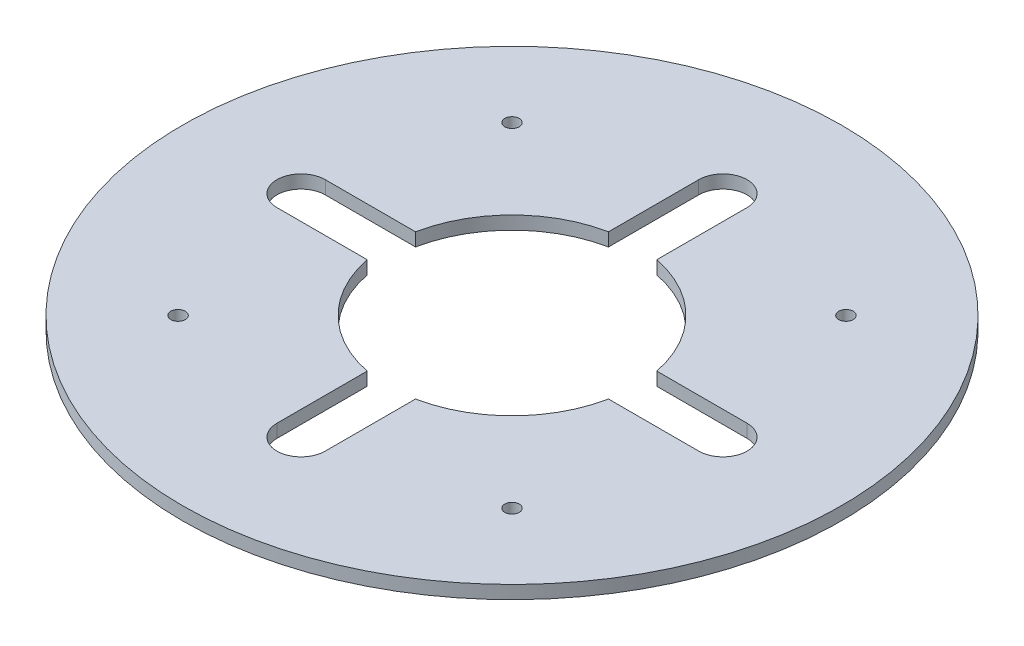
ISO-10303-21;
HEADER;
FILE_DESCRIPTION(('STEP AP214'),'2;1');
FILE_NAME('part.step','',(''),(''),'','','');
FILE_SCHEMA(('AUTOMOTIVE_DESIGN { 1 0 10303 214 1 1 1 1 }'));
ENDSEC;
DATA;
#1=APPLICATION_CONTEXT('core data for automotive mechanical design processes');
#2=APPLICATION_PROTOCOL_DEFINITION('international standard','automotive_design',2000,#1);
#3=PRODUCT_CONTEXT('',#1,'mechanical');
#4=PRODUCT('Part','Part','',(#3));
#5=PRODUCT_RELATED_PRODUCT_CATEGORY('part','',(#4));
#6=PRODUCT_DEFINITION_FORMATION('','',#4);
#7=PRODUCT_DEFINITION_CONTEXT('part definition',#1,'design');
#8=PRODUCT_DEFINITION('design','',#6,#7);
#9=PRODUCT_DEFINITION_SHAPE('','',#8);
#10=(LENGTH_UNIT() NAMED_UNIT(*) SI_UNIT(.MILLI.,.METRE.));
#11=(NAMED_UNIT(*) PLANE_ANGLE_UNIT() SI_UNIT($,.RADIAN.));
#12=(NAMED_UNIT(*) SI_UNIT($,.STERADIAN.) SOLID_ANGLE_UNIT());
#13=UNCERTAINTY_MEASURE_WITH_UNIT(LENGTH_MEASURE(1.E-05),#10,'distance_accuracy_value','');
#14=(GEOMETRIC_REPRESENTATION_CONTEXT(3) GLOBAL_UNCERTAINTY_ASSIGNED_CONTEXT((#13)) GLOBAL_UNIT_ASSIGNED_CONTEXT((#10,
#11,#12)) REPRESENTATION_CONTEXT('',''));
#15=CARTESIAN_POINT('',(0.,0.,0.));
#16=DIRECTION('',(0.,0.,1.));
#17=DIRECTION('',(1.,0.,0.));
#18=AXIS2_PLACEMENT_3D('',#15,#16,#17);
#19=CARTESIAN_POINT('',(0.,3.,0.));
#20=DIRECTION('',(0.,1.,0.));
#21=DIRECTION('',(0.,0.,1.));
#22=AXIS2_PLACEMENT_3D('',#19,#20,#21);
#23=PLANE('',#22);
#24=CARTESIAN_POINT('',(38.0000000000004,3.,37.9999999999996));
#25=DIRECTION('',(0.,1.,0.));
#26=DIRECTION('',(0.,0.,1.));
#27=AXIS2_PLACEMENT_3D('',#24,#25,#26);
#28=CIRCLE('',#27,1.65);
#29=CARTESIAN_POINT('',(38.0000000000004,3.,39.6499999999996));
#30=VERTEX_POINT('',#29);
#31=EDGE_CURVE('E445',#30,#30,#28,.T.);
#32=ORIENTED_EDGE('',*,*,#31,.F.);
#33=EDGE_LOOP('',(#32));
#34=FACE_BOUND('',#33,.T.);
#35=CARTESIAN_POINT('',(-38.,3.,38.));
#36=DIRECTION('',(0.,1.,0.));
#37=DIRECTION('',(0.,0.,1.));
#38=AXIS2_PLACEMENT_3D('',#35,#36,#37);
#39=CIRCLE('',#38,1.65);
#40=CARTESIAN_POINT('',(-38.,3.,39.65));
#41=VERTEX_POINT('',#40);
#42=EDGE_CURVE('E449',#41,#41,#39,.T.);
#43=ORIENTED_EDGE('',*,*,#42,.F.);
#44=EDGE_LOOP('',(#43));
#45=FACE_BOUND('',#44,.T.);
#46=CARTESIAN_POINT('',(-38.0000000000001,3.,-37.9999999999999));
#47=DIRECTION('',(0.,1.,0.));
#48=DIRECTION('',(0.,0.,1.));
#49=AXIS2_PLACEMENT_3D('',#46,#47,#48);
#50=CIRCLE('',#49,1.65);
#51=CARTESIAN_POINT('',(-38.0000000000001,3.,-36.3499999999999));
#52=VERTEX_POINT('',#51);
#53=EDGE_CURVE('E459',#52,#52,#50,.T.);
#54=ORIENTED_EDGE('',*,*,#53,.F.);
#55=EDGE_LOOP('',(#54));
#56=FACE_BOUND('',#55,.T.);
#57=CARTESIAN_POINT('',(38.,3.,-38.));
#58=DIRECTION('',(0.,1.,0.));
#59=DIRECTION('',(0.,0.,1.));
#60=AXIS2_PLACEMENT_3D('',#57,#58,#59);
#61=CIRCLE('',#60,1.65);
#62=CARTESIAN_POINT('',(38.,3.,-36.35));
#63=VERTEX_POINT('',#62);
#64=EDGE_CURVE('E466',#63,#63,#61,.T.);
#65=ORIENTED_EDGE('',*,*,#64,.F.);
#66=EDGE_LOOP('',(#65));
#67=FACE_BOUND('',#66,.T.);
#68=CARTESIAN_POINT('',(0.,3.,0.));
#69=DIRECTION('',(0.,1.,0.));
#70=DIRECTION('',(0.,0.,1.));
#71=AXIS2_PLACEMENT_3D('',#68,#69,#70);
#72=CIRCLE('',#71,75.);
#73=CARTESIAN_POINT('',(0.,3.,75.));
#74=VERTEX_POINT('',#73);
#75=EDGE_CURVE('E11',#74,#74,#72,.T.);
#76=ORIENTED_EDGE('',*,*,#75,.T.);
#77=EDGE_LOOP('',(#76));
#78=FACE_BOUND('',#77,.T.);
#79=CARTESIAN_POINT('',(-48.,3.,1.6759110426447E-13));
#80=DIRECTION('',(0.,1.,0.));
#81=DIRECTION('',(1.,0.,0.));
#82=AXIS2_PLACEMENT_3D('',#79,#80,#81);
#83=CIRCLE('',#82,5.5);
#84=CARTESIAN_POINT('',(-48.,3.,-5.49999999999983));
#85=VERTEX_POINT('',#84);
#86=CARTESIAN_POINT('',(-48.,3.,5.50000000000017));
#87=VERTEX_POINT('',#86);
#88=EDGE_CURVE('E250',#85,#87,#83,.T.);
#89=ORIENTED_EDGE('',*,*,#88,.F.);
#90=DIRECTION('',(1.,0.,0.));
#91=VECTOR('',#90,1.);
#92=CARTESIAN_POINT('',(0.,3.,-5.5));
#93=LINE('',#92,#91);
#94=CARTESIAN_POINT('',(-27.4545078265847,3.,-5.4999999999999));
#95=VERTEX_POINT('',#94);
#96=EDGE_CURVE('E225',#85,#95,#93,.T.);
#97=ORIENTED_EDGE('',*,*,#96,.T.);
#98=CARTESIAN_POINT('',(0.,3.,0.));
#99=DIRECTION('',(0.,1.,0.));
#100=DIRECTION('',(0.,0.,1.));
#101=AXIS2_PLACEMENT_3D('',#98,#99,#100);
#102=CIRCLE('',#101,28.);
#103=CARTESIAN_POINT('',(-5.5,3.,-27.4545078265847));
#104=VERTEX_POINT('',#103);
#105=EDGE_CURVE('E306',#104,#95,#102,.T.);
#106=ORIENTED_EDGE('',*,*,#105,.F.);
#107=DIRECTION('',(0.,0.,1.));
#108=VECTOR('',#107,1.);
#109=CARTESIAN_POINT('',(-5.5,3.,0.));
#110=LINE('',#109,#108);
#111=CARTESIAN_POINT('',(-5.5,3.,-48.));
#112=VERTEX_POINT('',#111);
#113=EDGE_CURVE('E274',#112,#104,#110,.T.);
#114=ORIENTED_EDGE('',*,*,#113,.F.);
#115=CARTESIAN_POINT('',(0.,3.,-48.));
#116=DIRECTION('',(0.,1.,0.));
#117=DIRECTION('',(0.,0.,1.));
#118=AXIS2_PLACEMENT_3D('',#115,#116,#117);
#119=CIRCLE('',#118,5.5);
#120=CARTESIAN_POINT('',(5.5,3.,-48.));
#121=VERTEX_POINT('',#120);
#122=EDGE_CURVE('E286',#121,#112,#119,.T.);
#123=ORIENTED_EDGE('',*,*,#122,.F.);
#124=DIRECTION('',(0.,0.,1.));
#125=VECTOR('',#124,1.);
#126=CARTESIAN_POINT('',(5.5,3.,0.));
#127=LINE('',#126,#125);
#128=CARTESIAN_POINT('',(5.5,3.,-27.4545078265847));
#129=VERTEX_POINT('',#128);
#130=EDGE_CURVE('E259',#121,#129,#127,.T.);
#131=ORIENTED_EDGE('',*,*,#130,.T.);
#132=CARTESIAN_POINT('',(27.4545078265846,3.,-5.50000000000029));
#133=VERTEX_POINT('',#132);
#134=EDGE_CURVE('E311',#133,#129,#102,.T.);
#135=ORIENTED_EDGE('',*,*,#134,.F.);
#136=DIRECTION('',(-1.,0.,0.));
#137=VECTOR('',#136,1.);
#138=CARTESIAN_POINT('',(0.,3.,-5.5));
#139=LINE('',#138,#137);
#140=CARTESIAN_POINT('',(47.9999999999999,3.,-5.5000000000005));
#141=VERTEX_POINT('',#140);
#142=EDGE_CURVE('E177',#141,#133,#139,.T.);
#143=ORIENTED_EDGE('',*,*,#142,.F.);
#144=CARTESIAN_POINT('',(48.,3.,-5.02773312793411E-13));
#145=DIRECTION('',(0.,1.,0.));
#146=DIRECTION('',(-1.,0.,0.));
#147=AXIS2_PLACEMENT_3D('',#144,#145,#146);
#148=CIRCLE('',#147,5.5);
#149=CARTESIAN_POINT('',(48.0000000000001,3.,5.4999999999995));
#150=VERTEX_POINT('',#149);
#151=EDGE_CURVE('E180',#150,#141,#148,.T.);
#152=ORIENTED_EDGE('',*,*,#151,.F.);
#153=DIRECTION('',(-1.,0.,0.));
#154=VECTOR('',#153,1.);
#155=CARTESIAN_POINT('',(0.,3.,5.5));
#156=LINE('',#155,#154);
#157=CARTESIAN_POINT('',(27.4545078265848,3.,5.49999999999971));
#158=VERTEX_POINT('',#157);
#159=EDGE_CURVE('E154',#150,#158,#156,.T.);
#160=ORIENTED_EDGE('',*,*,#159,.T.);
#161=CARTESIAN_POINT('',(5.5,3.,27.4545078265847));
#162=VERTEX_POINT('',#161);
#163=EDGE_CURVE('E319',#162,#158,#102,.T.);
#164=ORIENTED_EDGE('',*,*,#163,.F.);
#165=DIRECTION('',(0.,0.,-1.));
#166=VECTOR('',#165,1.);
#167=CARTESIAN_POINT('',(5.5,3.,0.));
#168=LINE('',#167,#166);
#169=CARTESIAN_POINT('',(5.5,3.,48.));
#170=VERTEX_POINT('',#169);
#171=EDGE_CURVE('E62',#170,#162,#168,.T.);
#172=ORIENTED_EDGE('',*,*,#171,.F.);
#173=CARTESIAN_POINT('',(0.,3.,48.));
#174=DIRECTION('',(0.,1.,0.));
#175=DIRECTION('',(0.,0.,-1.));
#176=AXIS2_PLACEMENT_3D('',#173,#174,#175);
#177=CIRCLE('',#176,5.5);
#178=CARTESIAN_POINT('',(-5.5,3.,48.));
#179=VERTEX_POINT('',#178);
#180=EDGE_CURVE('E216',#179,#170,#177,.T.);
#181=ORIENTED_EDGE('',*,*,#180,.F.);
#182=DIRECTION('',(0.,0.,-1.));
#183=VECTOR('',#182,1.);
#184=CARTESIAN_POINT('',(-5.5,3.,0.));
#185=LINE('',#184,#183);
#186=CARTESIAN_POINT('',(-5.5,3.,27.4545078265847));
#187=VERTEX_POINT('',#186);
#188=EDGE_CURVE('E195',#179,#187,#185,.T.);
#189=ORIENTED_EDGE('',*,*,#188,.T.);
#190=CARTESIAN_POINT('',(-27.4545078265847,3.,5.5000000000001));
#191=VERTEX_POINT('',#190);
#192=EDGE_CURVE('E310',#191,#187,#102,.T.);
#193=ORIENTED_EDGE('',*,*,#192,.F.);
#194=DIRECTION('',(1.,0.,0.));
#195=VECTOR('',#194,1.);
#196=CARTESIAN_POINT('',(0.,3.,5.5));
#197=LINE('',#196,#195);
#198=EDGE_CURVE('E238',#87,#191,#197,.T.);
#199=ORIENTED_EDGE('',*,*,#198,.F.);
#200=EDGE_LOOP('',(#89,#97,#106,#114,#123,#131,#135,#143,#152,#160,#164,#172,#181,#189,#193,#199));
#201=FACE_BOUND('',#200,.T.);
#202=ADVANCED_FACE('F38',(#34,#45,#56,#67,#78,#201),#23,.T.);
#203=CARTESIAN_POINT('',(0.,0.,0.));
#204=DIRECTION('',(0.,1.,0.));
#205=DIRECTION('',(0.,0.,1.));
#206=AXIS2_PLACEMENT_3D('',#203,#204,#205);
#207=PLANE('',#206);
#208=CARTESIAN_POINT('',(38.0000000000004,0.,37.9999999999996));
#209=DIRECTION('',(0.,1.,0.));
#210=DIRECTION('',(0.,0.,1.));
#211=AXIS2_PLACEMENT_3D('',#208,#209,#210);
#212=CIRCLE('',#211,1.65);
#213=CARTESIAN_POINT('',(38.0000000000004,0.,39.6499999999996));
#214=VERTEX_POINT('',#213);
#215=EDGE_CURVE('E442',#214,#214,#212,.T.);
#216=ORIENTED_EDGE('',*,*,#215,.T.);
#217=EDGE_LOOP('',(#216));
#218=FACE_BOUND('',#217,.T.);
#219=CARTESIAN_POINT('',(-38.,0.,38.));
#220=DIRECTION('',(0.,1.,0.));
#221=DIRECTION('',(0.,0.,1.));
#222=AXIS2_PLACEMENT_3D('',#219,#220,#221);
#223=CIRCLE('',#222,1.65);
#224=CARTESIAN_POINT('',(-38.,0.,39.65));
#225=VERTEX_POINT('',#224);
#226=EDGE_CURVE('E455',#225,#225,#223,.T.);
#227=ORIENTED_EDGE('',*,*,#226,.T.);
#228=EDGE_LOOP('',(#227));
#229=FACE_BOUND('',#228,.T.);
#230=CARTESIAN_POINT('',(-38.0000000000001,0.,-37.9999999999999));
#231=DIRECTION('',(0.,1.,0.));
#232=DIRECTION('',(0.,0.,1.));
#233=AXIS2_PLACEMENT_3D('',#230,#231,#232);
#234=CIRCLE('',#233,1.65);
#235=CARTESIAN_POINT('',(-38.0000000000001,0.,-36.3499999999999));
#236=VERTEX_POINT('',#235);
#237=EDGE_CURVE('E463',#236,#236,#234,.T.);
#238=ORIENTED_EDGE('',*,*,#237,.T.);
#239=EDGE_LOOP('',(#238));
#240=FACE_BOUND('',#239,.T.);
#241=CARTESIAN_POINT('',(38.,0.,-38.));
#242=DIRECTION('',(0.,1.,0.));
#243=DIRECTION('',(0.,0.,1.));
#244=AXIS2_PLACEMENT_3D('',#241,#242,#243);
#245=CIRCLE('',#244,1.65);
#246=CARTESIAN_POINT('',(38.,0.,-36.35));
#247=VERTEX_POINT('',#246);
#248=EDGE_CURVE('E183',#247,#247,#245,.T.);
#249=ORIENTED_EDGE('',*,*,#248,.T.);
#250=EDGE_LOOP('',(#249));
#251=FACE_BOUND('',#250,.T.);
#252=CARTESIAN_POINT('',(0.,0.,0.));
#253=DIRECTION('',(0.,1.,0.));
#254=DIRECTION('',(0.,0.,1.));
#255=AXIS2_PLACEMENT_3D('',#252,#253,#254);
#256=CIRCLE('',#255,75.);
#257=CARTESIAN_POINT('',(0.,0.,75.));
#258=VERTEX_POINT('',#257);
#259=EDGE_CURVE('E42',#258,#258,#256,.T.);
#260=ORIENTED_EDGE('',*,*,#259,.F.);
#261=EDGE_LOOP('',(#260));
#262=FACE_BOUND('',#261,.T.);
#263=DIRECTION('',(1.,0.,0.));
#264=VECTOR('',#263,1.);
#265=CARTESIAN_POINT('',(0.,0.,-5.5));
#266=LINE('',#265,#264);
#267=CARTESIAN_POINT('',(-48.,0.,-5.49999999999983));
#268=VERTEX_POINT('',#267);
#269=CARTESIAN_POINT('',(-27.4545078265847,0.,-5.4999999999999));
#270=VERTEX_POINT('',#269);
#271=EDGE_CURVE('E234',#268,#270,#266,.T.);
#272=ORIENTED_EDGE('',*,*,#271,.F.);
#273=CARTESIAN_POINT('',(-48.,0.,1.6759110426447E-13));
#274=DIRECTION('',(0.,1.,0.));
#275=DIRECTION('',(1.,0.,0.));
#276=AXIS2_PLACEMENT_3D('',#273,#274,#275);
#277=CIRCLE('',#276,5.5);
#278=CARTESIAN_POINT('',(-48.,0.,5.50000000000017));
#279=VERTEX_POINT('',#278);
#280=EDGE_CURVE('E237',#268,#279,#277,.T.);
#281=ORIENTED_EDGE('',*,*,#280,.T.);
#282=DIRECTION('',(1.,0.,0.));
#283=VECTOR('',#282,1.);
#284=CARTESIAN_POINT('',(0.,0.,5.5));
#285=LINE('',#284,#283);
#286=CARTESIAN_POINT('',(-27.4545078265847,0.,5.50000000000009));
#287=VERTEX_POINT('',#286);
#288=EDGE_CURVE('E242',#279,#287,#285,.T.);
#289=ORIENTED_EDGE('',*,*,#288,.T.);
#290=CARTESIAN_POINT('',(0.,0.,0.));
#291=DIRECTION('',(0.,1.,0.));
#292=DIRECTION('',(0.,0.,1.));
#293=AXIS2_PLACEMENT_3D('',#290,#291,#292);
#294=CIRCLE('',#293,28.);
#295=CARTESIAN_POINT('',(-5.5,0.,27.4545078265847));
#296=VERTEX_POINT('',#295);
#297=EDGE_CURVE('E315',#287,#296,#294,.T.);
#298=ORIENTED_EDGE('',*,*,#297,.T.);
#299=DIRECTION('',(0.,0.,-1.));
#300=VECTOR('',#299,1.);
#301=CARTESIAN_POINT('',(-5.5,0.,0.));
#302=LINE('',#301,#300);
#303=CARTESIAN_POINT('',(-5.5,0.,48.));
#304=VERTEX_POINT('',#303);
#305=EDGE_CURVE('E202',#304,#296,#302,.T.);
#306=ORIENTED_EDGE('',*,*,#305,.F.);
#307=CARTESIAN_POINT('',(0.,0.,48.));
#308=DIRECTION('',(0.,1.,0.));
#309=DIRECTION('',(0.,0.,-1.));
#310=AXIS2_PLACEMENT_3D('',#307,#308,#309);
#311=CIRCLE('',#310,5.5);
#312=CARTESIAN_POINT('',(5.5,0.,48.));
#313=VERTEX_POINT('',#312);
#314=EDGE_CURVE('E205',#304,#313,#311,.T.);
#315=ORIENTED_EDGE('',*,*,#314,.T.);
#316=DIRECTION('',(0.,0.,-1.));
#317=VECTOR('',#316,1.);
#318=CARTESIAN_POINT('',(5.5,0.,0.));
#319=LINE('',#318,#317);
#320=CARTESIAN_POINT('',(5.5,0.,27.4545078265847));
#321=VERTEX_POINT('',#320);
#322=EDGE_CURVE('E209',#313,#321,#319,.T.);
#323=ORIENTED_EDGE('',*,*,#322,.T.);
#324=CARTESIAN_POINT('',(27.4545078265847,0.,5.49999999999971));
#325=VERTEX_POINT('',#324);
#326=EDGE_CURVE('E175',#321,#325,#294,.T.);
#327=ORIENTED_EDGE('',*,*,#326,.T.);
#328=DIRECTION('',(-1.,0.,0.));
#329=VECTOR('',#328,1.);
#330=CARTESIAN_POINT('',(0.,0.,5.5));
#331=LINE('',#330,#329);
#332=CARTESIAN_POINT('',(48.0000000000001,0.,5.4999999999995));
#333=VERTEX_POINT('',#332);
#334=EDGE_CURVE('E54',#333,#325,#331,.T.);
#335=ORIENTED_EDGE('',*,*,#334,.F.);
#336=CARTESIAN_POINT('',(48.,0.,-5.02773312793411E-13));
#337=DIRECTION('',(0.,1.,0.));
#338=DIRECTION('',(-1.,0.,0.));
#339=AXIS2_PLACEMENT_3D('',#336,#337,#338);
#340=CIRCLE('',#339,5.5);
#341=CARTESIAN_POINT('',(47.9999999999999,0.,-5.5000000000005));
#342=VERTEX_POINT('',#341);
#343=EDGE_CURVE('E163',#333,#342,#340,.T.);
#344=ORIENTED_EDGE('',*,*,#343,.T.);
#345=DIRECTION('',(-1.,0.,0.));
#346=VECTOR('',#345,1.);
#347=CARTESIAN_POINT('',(0.,0.,-5.5));
#348=LINE('',#347,#346);
#349=CARTESIAN_POINT('',(27.4545078265846,0.,-5.50000000000029));
#350=VERTEX_POINT('',#349);
#351=EDGE_CURVE('E160',#342,#350,#348,.T.);
#352=ORIENTED_EDGE('',*,*,#351,.T.);
#353=CARTESIAN_POINT('',(5.5,0.,-27.4545078265847));
#354=VERTEX_POINT('',#353);
#355=EDGE_CURVE('E296',#350,#354,#294,.T.);
#356=ORIENTED_EDGE('',*,*,#355,.T.);
#357=DIRECTION('',(0.,0.,1.));
#358=VECTOR('',#357,1.);
#359=CARTESIAN_POINT('',(5.5,0.,0.));
#360=LINE('',#359,#358);
#361=CARTESIAN_POINT('',(5.5,0.,-48.));
#362=VERTEX_POINT('',#361);
#363=EDGE_CURVE('E269',#362,#354,#360,.T.);
#364=ORIENTED_EDGE('',*,*,#363,.F.);
#365=CARTESIAN_POINT('',(0.,0.,-48.));
#366=DIRECTION('',(0.,1.,0.));
#367=DIRECTION('',(0.,0.,1.));
#368=AXIS2_PLACEMENT_3D('',#365,#366,#367);
#369=CIRCLE('',#368,5.5);
#370=CARTESIAN_POINT('',(-5.5,0.,-48.));
#371=VERTEX_POINT('',#370);
#372=EDGE_CURVE('E273',#362,#371,#369,.T.);
#373=ORIENTED_EDGE('',*,*,#372,.T.);
#374=DIRECTION('',(0.,0.,1.));
#375=VECTOR('',#374,1.);
#376=CARTESIAN_POINT('',(-5.5,0.,0.));
#377=LINE('',#376,#375);
#378=CARTESIAN_POINT('',(-5.5,0.,-27.4545078265847));
#379=VERTEX_POINT('',#378);
#380=EDGE_CURVE('E278',#371,#379,#377,.T.);
#381=ORIENTED_EDGE('',*,*,#380,.T.);
#382=EDGE_CURVE('E312',#379,#270,#294,.T.);
#383=ORIENTED_EDGE('',*,*,#382,.T.);
#384=EDGE_LOOP('',(#272,#281,#289,#298,#306,#315,#323,#327,#335,#344,#352,#356,#364,#373,#381,#383));
#385=FACE_BOUND('',#384,.T.);
#386=ADVANCED_FACE('F172',(#218,#229,#240,#251,#262,#385),#207,.F.);
#387=CARTESIAN_POINT('',(0.,3.,0.));
#388=DIRECTION('',(0.,-1.,0.));
#389=DIRECTION('',(0.,0.,-1.));
#390=AXIS2_PLACEMENT_3D('',#387,#388,#389);
#391=CYLINDRICAL_SURFACE('',#390,28.);
#392=ORIENTED_EDGE('',*,*,#105,.T.);
#393=DIRECTION('',(0.,1.,0.));
#394=VECTOR('',#393,1.);
#395=CARTESIAN_POINT('',(-27.4545078265847,0.,-5.4999999999999));
#396=LINE('',#395,#394);
#397=EDGE_CURVE('E256',#270,#95,#396,.T.);
#398=ORIENTED_EDGE('',*,*,#397,.F.);
#399=ORIENTED_EDGE('',*,*,#382,.F.);
#400=DIRECTION('',(0.,1.,0.));
#401=VECTOR('',#400,1.);
#402=CARTESIAN_POINT('',(-5.5,0.,-27.4545078265847));
#403=LINE('',#402,#401);
#404=EDGE_CURVE('E297',#379,#104,#403,.T.);
#405=ORIENTED_EDGE('',*,*,#404,.T.);
#406=EDGE_LOOP('',(#392,#398,#399,#405));
#407=FACE_BOUND('',#406,.T.);
#408=ADVANCED_FACE('F345',(#407),#391,.F.);
#409=ORIENTED_EDGE('',*,*,#163,.T.);
#410=DIRECTION('',(0.,1.,0.));
#411=VECTOR('',#410,1.);
#412=CARTESIAN_POINT('',(27.4545078265848,0.,5.49999999999971));
#413=LINE('',#412,#411);
#414=EDGE_CURVE('E192',#325,#158,#413,.T.);
#415=ORIENTED_EDGE('',*,*,#414,.F.);
#416=ORIENTED_EDGE('',*,*,#326,.F.);
#417=DIRECTION('',(0.,1.,0.));
#418=VECTOR('',#417,1.);
#419=CARTESIAN_POINT('',(5.5,0.,27.4545078265847));
#420=LINE('',#419,#418);
#421=EDGE_CURVE('E226',#321,#162,#420,.T.);
#422=ORIENTED_EDGE('',*,*,#421,.T.);
#423=EDGE_LOOP('',(#409,#415,#416,#422));
#424=FACE_BOUND('',#423,.T.);
#425=ADVANCED_FACE('F373',(#424),#391,.F.);
#426=DIRECTION('',(0.,1.,0.));
#427=VECTOR('',#426,1.);
#428=CARTESIAN_POINT('',(-27.4545078265847,0.,5.50000000000009));
#429=LINE('',#428,#427);
#430=EDGE_CURVE('E260',#287,#191,#429,.T.);
#431=ORIENTED_EDGE('',*,*,#430,.T.);
#432=ORIENTED_EDGE('',*,*,#192,.T.);
#433=DIRECTION('',(0.,1.,0.));
#434=VECTOR('',#433,1.);
#435=CARTESIAN_POINT('',(-5.5,0.,27.4545078265847));
#436=LINE('',#435,#434);
#437=EDGE_CURVE('E222',#296,#187,#436,.T.);
#438=ORIENTED_EDGE('',*,*,#437,.F.);
#439=ORIENTED_EDGE('',*,*,#297,.F.);
#440=EDGE_LOOP('',(#431,#432,#438,#439));
#441=FACE_BOUND('',#440,.T.);
#442=ADVANCED_FACE('F360',(#441),#391,.F.);
#443=DIRECTION('',(0.,1.,0.));
#444=VECTOR('',#443,1.);
#445=CARTESIAN_POINT('',(27.4545078265846,0.,-5.50000000000029));
#446=LINE('',#445,#444);
#447=EDGE_CURVE('E196',#350,#133,#446,.T.);
#448=ORIENTED_EDGE('',*,*,#447,.T.);
#449=ORIENTED_EDGE('',*,*,#134,.T.);
#450=DIRECTION('',(0.,1.,0.));
#451=VECTOR('',#450,1.);
#452=CARTESIAN_POINT('',(5.5,0.,-27.4545078265847));
#453=LINE('',#452,#451);
#454=EDGE_CURVE('E292',#354,#129,#453,.T.);
#455=ORIENTED_EDGE('',*,*,#454,.F.);
#456=ORIENTED_EDGE('',*,*,#355,.F.);
#457=EDGE_LOOP('',(#448,#449,#455,#456));
#458=FACE_BOUND('',#457,.T.);
#459=ADVANCED_FACE('F331',(#458),#391,.F.);
#460=CARTESIAN_POINT('',(0.,3.,0.));
#461=DIRECTION('',(0.,-1.,0.));
#462=DIRECTION('',(0.,0.,-1.));
#463=AXIS2_PLACEMENT_3D('',#460,#461,#462);
#464=CYLINDRICAL_SURFACE('',#463,75.);
#465=ORIENTED_EDGE('',*,*,#75,.F.);
#466=EDGE_LOOP('',(#465));
#467=FACE_BOUND('',#466,.T.);
#468=ORIENTED_EDGE('',*,*,#259,.T.);
#469=EDGE_LOOP('',(#468));
#470=FACE_BOUND('',#469,.T.);
#471=ADVANCED_FACE('F40',(#467,#470),#464,.T.);
#472=CARTESIAN_POINT('',(5.5,0.,0.));
#473=DIRECTION('',(-1.,0.,0.));
#474=DIRECTION('',(0.,0.,1.));
#475=AXIS2_PLACEMENT_3D('',#472,#473,#474);
#476=PLANE('',#475);
#477=ORIENTED_EDGE('',*,*,#130,.F.);
#478=DIRECTION('',(0.,1.,0.));
#479=VECTOR('',#478,1.);
#480=CARTESIAN_POINT('',(5.5,0.,-48.));
#481=LINE('',#480,#479);
#482=EDGE_CURVE('E282',#362,#121,#481,.T.);
#483=ORIENTED_EDGE('',*,*,#482,.F.);
#484=ORIENTED_EDGE('',*,*,#363,.T.);
#485=ORIENTED_EDGE('',*,*,#454,.T.);
#486=EDGE_LOOP('',(#477,#483,#484,#485));
#487=FACE_BOUND('',#486,.T.);
#488=ADVANCED_FACE('F329',(#487),#476,.T.);
#489=CARTESIAN_POINT('',(-5.5,0.,0.));
#490=DIRECTION('',(-1.,0.,0.));
#491=DIRECTION('',(0.,0.,1.));
#492=AXIS2_PLACEMENT_3D('',#489,#490,#491);
#493=PLANE('',#492);
#494=ORIENTED_EDGE('',*,*,#113,.T.);
#495=ORIENTED_EDGE('',*,*,#404,.F.);
#496=ORIENTED_EDGE('',*,*,#380,.F.);
#497=DIRECTION('',(0.,1.,0.));
#498=VECTOR('',#497,1.);
#499=CARTESIAN_POINT('',(-5.5,0.,-48.));
#500=LINE('',#499,#498);
#501=EDGE_CURVE('E301',#371,#112,#500,.T.);
#502=ORIENTED_EDGE('',*,*,#501,.T.);
#503=EDGE_LOOP('',(#494,#495,#496,#502));
#504=FACE_BOUND('',#503,.T.);
#505=ADVANCED_FACE('F396',(#504),#493,.F.);
#506=CARTESIAN_POINT('',(0.,0.,-48.));
#507=DIRECTION('',(0.,1.,0.));
#508=DIRECTION('',(0.,0.,1.));
#509=AXIS2_PLACEMENT_3D('',#506,#507,#508);
#510=CYLINDRICAL_SURFACE('',#509,5.5);
#511=ORIENTED_EDGE('',*,*,#122,.T.);
#512=ORIENTED_EDGE('',*,*,#501,.F.);
#513=ORIENTED_EDGE('',*,*,#372,.F.);
#514=ORIENTED_EDGE('',*,*,#482,.T.);
#515=EDGE_LOOP('',(#511,#512,#513,#514));
#516=FACE_BOUND('',#515,.T.);
#517=ADVANCED_FACE('F340',(#516),#510,.F.);
#518=CARTESIAN_POINT('',(5.5,0.,0.));
#519=DIRECTION('',(1.,0.,0.));
#520=DIRECTION('',(0.,0.,-1.));
#521=AXIS2_PLACEMENT_3D('',#518,#519,#520);
#522=PLANE('',#521);
#523=ORIENTED_EDGE('',*,*,#171,.T.);
#524=ORIENTED_EDGE('',*,*,#421,.F.);
#525=ORIENTED_EDGE('',*,*,#322,.F.);
#526=DIRECTION('',(0.,1.,0.));
#527=VECTOR('',#526,1.);
#528=CARTESIAN_POINT('',(5.5,0.,48.));
#529=LINE('',#528,#527);
#530=EDGE_CURVE('E229',#313,#170,#529,.T.);
#531=ORIENTED_EDGE('',*,*,#530,.T.);
#532=EDGE_LOOP('',(#523,#524,#525,#531));
#533=FACE_BOUND('',#532,.T.);
#534=ADVANCED_FACE('F399',(#533),#522,.F.);
#535=CARTESIAN_POINT('',(-5.5,0.,0.));
#536=DIRECTION('',(1.,0.,0.));
#537=DIRECTION('',(0.,0.,-1.));
#538=AXIS2_PLACEMENT_3D('',#535,#536,#537);
#539=PLANE('',#538);
#540=ORIENTED_EDGE('',*,*,#188,.F.);
#541=DIRECTION('',(0.,1.,0.));
#542=VECTOR('',#541,1.);
#543=CARTESIAN_POINT('',(-5.5,0.,48.));
#544=LINE('',#543,#542);
#545=EDGE_CURVE('E212',#304,#179,#544,.T.);
#546=ORIENTED_EDGE('',*,*,#545,.F.);
#547=ORIENTED_EDGE('',*,*,#305,.T.);
#548=ORIENTED_EDGE('',*,*,#437,.T.);
#549=EDGE_LOOP('',(#540,#546,#547,#548));
#550=FACE_BOUND('',#549,.T.);
#551=ADVANCED_FACE('F364',(#550),#539,.T.);
#552=CARTESIAN_POINT('',(0.,0.,48.));
#553=DIRECTION('',(0.,1.,0.));
#554=DIRECTION('',(0.,0.,1.));
#555=AXIS2_PLACEMENT_3D('',#552,#553,#554);
#556=CYLINDRICAL_SURFACE('',#555,5.5);
#557=ORIENTED_EDGE('',*,*,#180,.T.);
#558=ORIENTED_EDGE('',*,*,#530,.F.);
#559=ORIENTED_EDGE('',*,*,#314,.F.);
#560=ORIENTED_EDGE('',*,*,#545,.T.);
#561=EDGE_LOOP('',(#557,#558,#559,#560));
#562=FACE_BOUND('',#561,.T.);
#563=ADVANCED_FACE('F368',(#562),#556,.F.);
#564=CARTESIAN_POINT('',(0.,0.,-5.5));
#565=DIRECTION('',(0.,0.,-1.));
#566=DIRECTION('',(-1.,0.,0.));
#567=AXIS2_PLACEMENT_3D('',#564,#565,#566);
#568=PLANE('',#567);
#569=ORIENTED_EDGE('',*,*,#142,.T.);
#570=ORIENTED_EDGE('',*,*,#447,.F.);
#571=ORIENTED_EDGE('',*,*,#351,.F.);
#572=DIRECTION('',(0.,1.,0.));
#573=VECTOR('',#572,1.);
#574=CARTESIAN_POINT('',(47.9999999999999,0.,-5.5000000000005));
#575=LINE('',#574,#573);
#576=EDGE_CURVE('E159',#342,#141,#575,.T.);
#577=ORIENTED_EDGE('',*,*,#576,.T.);
#578=EDGE_LOOP('',(#569,#570,#571,#577));
#579=FACE_BOUND('',#578,.T.);
#580=ADVANCED_FACE('F414',(#579),#568,.F.);
#581=CARTESIAN_POINT('',(0.,0.,5.5));
#582=DIRECTION('',(0.,0.,-1.));
#583=DIRECTION('',(-1.,0.,0.));
#584=AXIS2_PLACEMENT_3D('',#581,#582,#583);
#585=PLANE('',#584);
#586=ORIENTED_EDGE('',*,*,#159,.F.);
#587=DIRECTION('',(0.,1.,0.));
#588=VECTOR('',#587,1.);
#589=CARTESIAN_POINT('',(48.0000000000001,0.,5.4999999999995));
#590=LINE('',#589,#588);
#591=EDGE_CURVE('E150',#333,#150,#590,.T.);
#592=ORIENTED_EDGE('',*,*,#591,.F.);
#593=ORIENTED_EDGE('',*,*,#334,.T.);
#594=ORIENTED_EDGE('',*,*,#414,.T.);
#595=EDGE_LOOP('',(#586,#592,#593,#594));
#596=FACE_BOUND('',#595,.T.);
#597=ADVANCED_FACE('F152',(#596),#585,.T.);
#598=CARTESIAN_POINT('',(48.,0.,-5.02773312793411E-13));
#599=DIRECTION('',(0.,1.,0.));
#600=DIRECTION('',(0.,0.,1.));
#601=AXIS2_PLACEMENT_3D('',#598,#599,#600);
#602=CYLINDRICAL_SURFACE('',#601,5.5);
#603=ORIENTED_EDGE('',*,*,#151,.T.);
#604=ORIENTED_EDGE('',*,*,#576,.F.);
#605=ORIENTED_EDGE('',*,*,#343,.F.);
#606=ORIENTED_EDGE('',*,*,#591,.T.);
#607=EDGE_LOOP('',(#603,#604,#605,#606));
#608=FACE_BOUND('',#607,.T.);
#609=ADVANCED_FACE('F164',(#608),#602,.F.);
#610=CARTESIAN_POINT('',(0.,0.,-5.5));
#611=DIRECTION('',(0.,0.,1.));
#612=DIRECTION('',(1.,0.,0.));
#613=AXIS2_PLACEMENT_3D('',#610,#611,#612);
#614=PLANE('',#613);
#615=ORIENTED_EDGE('',*,*,#96,.F.);
#616=DIRECTION('',(0.,1.,0.));
#617=VECTOR('',#616,1.);
#618=CARTESIAN_POINT('',(-48.,0.,-5.49999999999983));
#619=LINE('',#618,#617);
#620=EDGE_CURVE('E246',#268,#85,#619,.T.);
#621=ORIENTED_EDGE('',*,*,#620,.F.);
#622=ORIENTED_EDGE('',*,*,#271,.T.);
#623=ORIENTED_EDGE('',*,*,#397,.T.);
#624=EDGE_LOOP('',(#615,#621,#622,#623));
#625=FACE_BOUND('',#624,.T.);
#626=ADVANCED_FACE('F348',(#625),#614,.T.);
#627=CARTESIAN_POINT('',(0.,0.,5.5));
#628=DIRECTION('',(0.,0.,1.));
#629=DIRECTION('',(1.,0.,0.));
#630=AXIS2_PLACEMENT_3D('',#627,#628,#629);
#631=PLANE('',#630);
#632=ORIENTED_EDGE('',*,*,#198,.T.);
#633=ORIENTED_EDGE('',*,*,#430,.F.);
#634=ORIENTED_EDGE('',*,*,#288,.F.);
#635=DIRECTION('',(0.,1.,0.));
#636=VECTOR('',#635,1.);
#637=CARTESIAN_POINT('',(-48.,0.,5.50000000000017));
#638=LINE('',#637,#636);
#639=EDGE_CURVE('E264',#279,#87,#638,.T.);
#640=ORIENTED_EDGE('',*,*,#639,.T.);
#641=EDGE_LOOP('',(#632,#633,#634,#640));
#642=FACE_BOUND('',#641,.T.);
#643=ADVANCED_FACE('F404',(#642),#631,.F.);
#644=CARTESIAN_POINT('',(-48.,0.,1.6759110426447E-13));
#645=DIRECTION('',(0.,1.,0.));
#646=DIRECTION('',(0.,0.,1.));
#647=AXIS2_PLACEMENT_3D('',#644,#645,#646);
#648=CYLINDRICAL_SURFACE('',#647,5.5);
#649=ORIENTED_EDGE('',*,*,#88,.T.);
#650=ORIENTED_EDGE('',*,*,#639,.F.);
#651=ORIENTED_EDGE('',*,*,#280,.F.);
#652=ORIENTED_EDGE('',*,*,#620,.T.);
#653=EDGE_LOOP('',(#649,#650,#651,#652));
#654=FACE_BOUND('',#653,.T.);
#655=ADVANCED_FACE('F352',(#654),#648,.F.);
#656=CARTESIAN_POINT('',(38.,3.,-38.));
#657=DIRECTION('',(0.,1.,0.));
#658=DIRECTION('',(0.,0.,1.));
#659=AXIS2_PLACEMENT_3D('',#656,#657,#658);
#660=CYLINDRICAL_SURFACE('',#659,1.65);
#661=ORIENTED_EDGE('',*,*,#248,.F.);
#662=EDGE_LOOP('',(#661));
#663=FACE_BOUND('',#662,.T.);
#664=ORIENTED_EDGE('',*,*,#64,.T.);
#665=EDGE_LOOP('',(#664));
#666=FACE_BOUND('',#665,.T.);
#667=ADVANCED_FACE('F407',(#663,#666),#660,.F.);
#668=CARTESIAN_POINT('',(-38.0000000000001,3.,-37.9999999999999));
#669=DIRECTION('',(0.,1.,0.));
#670=DIRECTION('',(0.,0.,1.));
#671=AXIS2_PLACEMENT_3D('',#668,#669,#670);
#672=CYLINDRICAL_SURFACE('',#671,1.65);
#673=ORIENTED_EDGE('',*,*,#237,.F.);
#674=EDGE_LOOP('',(#673));
#675=FACE_BOUND('',#674,.T.);
#676=ORIENTED_EDGE('',*,*,#53,.T.);
#677=EDGE_LOOP('',(#676));
#678=FACE_BOUND('',#677,.T.);
#679=ADVANCED_FACE('F426',(#675,#678),#672,.F.);
#680=CARTESIAN_POINT('',(-38.,3.,38.));
#681=DIRECTION('',(0.,1.,0.));
#682=DIRECTION('',(0.,0.,1.));
#683=AXIS2_PLACEMENT_3D('',#680,#681,#682);
#684=CYLINDRICAL_SURFACE('',#683,1.65);
#685=ORIENTED_EDGE('',*,*,#226,.F.);
#686=EDGE_LOOP('',(#685));
#687=FACE_BOUND('',#686,.T.);
#688=ORIENTED_EDGE('',*,*,#42,.T.);
#689=EDGE_LOOP('',(#688));
#690=FACE_BOUND('',#689,.T.);
#691=ADVANCED_FACE('F430',(#687,#690),#684,.F.);
#692=CARTESIAN_POINT('',(38.0000000000004,3.,37.9999999999996));
#693=DIRECTION('',(0.,1.,0.));
#694=DIRECTION('',(0.,0.,1.));
#695=AXIS2_PLACEMENT_3D('',#692,#693,#694);
#696=CYLINDRICAL_SURFACE('',#695,1.65);
#697=ORIENTED_EDGE('',*,*,#215,.F.);
#698=EDGE_LOOP('',(#697));
#699=FACE_BOUND('',#698,.T.);
#700=ORIENTED_EDGE('',*,*,#31,.T.);
#701=EDGE_LOOP('',(#700));
#702=FACE_BOUND('',#701,.T.);
#703=ADVANCED_FACE('F434',(#699,#702),#696,.F.);
#704=CLOSED_SHELL('',(#202,#386,#408,#425,#442,#459,#471,#488,#505,#517,#534,#551,#563,#580,
#597,#609,#626,#643,#655,#667,#679,#691,#703));
#705=MANIFOLD_SOLID_BREP('B2',#704);
#706=ADVANCED_BREP_SHAPE_REPRESENTATION('',(#18,#705),#14);
#707=SHAPE_DEFINITION_REPRESENTATION(#9,#706);
ENDSEC;
END-ISO-10303-21;
